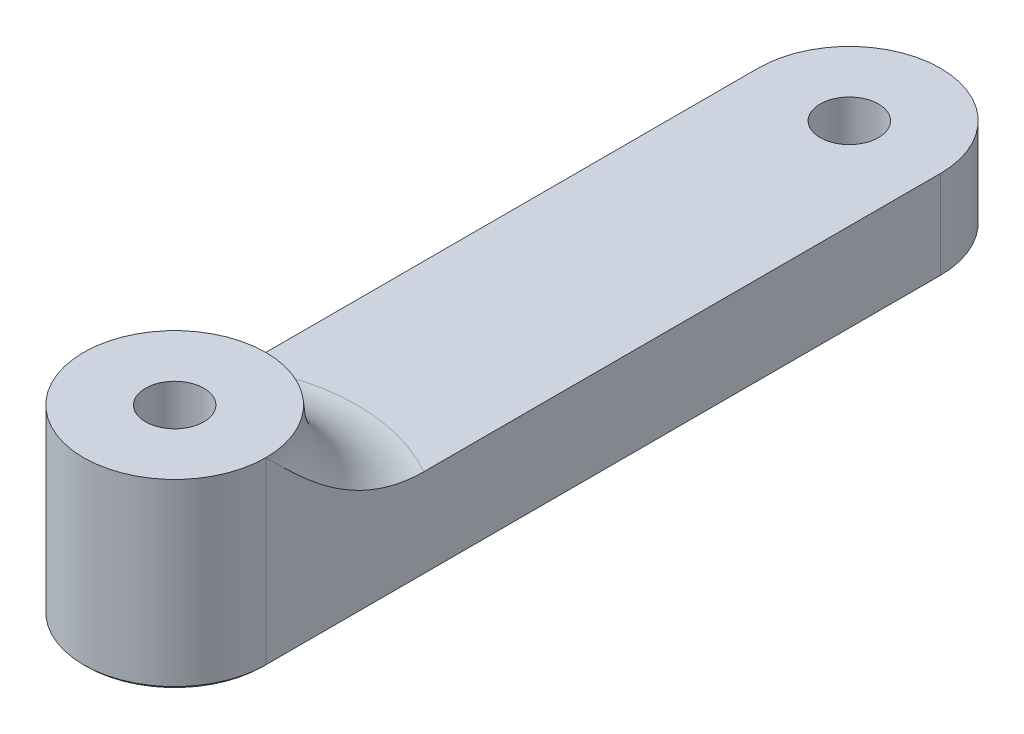
ISO-10303-21;
HEADER;
FILE_DESCRIPTION(('STEP AP214'),'2;1');
FILE_NAME('part.step','',(''),(''),'','','');
FILE_SCHEMA(('AUTOMOTIVE_DESIGN { 1 0 10303 214 1 1 1 1 }'));
ENDSEC;
DATA;
#1=APPLICATION_CONTEXT('core data for automotive mechanical design processes');
#2=APPLICATION_PROTOCOL_DEFINITION('international standard','automotive_design',2000,#1);
#3=PRODUCT_CONTEXT('',#1,'mechanical');
#4=PRODUCT('Part','Part','',(#3));
#5=PRODUCT_RELATED_PRODUCT_CATEGORY('part','',(#4));
#6=PRODUCT_DEFINITION_FORMATION('','',#4);
#7=PRODUCT_DEFINITION_CONTEXT('part definition',#1,'design');
#8=PRODUCT_DEFINITION('design','',#6,#7);
#9=PRODUCT_DEFINITION_SHAPE('','',#8);
#10=(LENGTH_UNIT() NAMED_UNIT(*) SI_UNIT(.MILLI.,.METRE.));
#11=(NAMED_UNIT(*) PLANE_ANGLE_UNIT() SI_UNIT($,.RADIAN.));
#12=(NAMED_UNIT(*) SI_UNIT($,.STERADIAN.) SOLID_ANGLE_UNIT());
#13=UNCERTAINTY_MEASURE_WITH_UNIT(LENGTH_MEASURE(1.E-05),#10,'distance_accuracy_value','');
#14=(GEOMETRIC_REPRESENTATION_CONTEXT(3) GLOBAL_UNCERTAINTY_ASSIGNED_CONTEXT((#13)) GLOBAL_UNIT_ASSIGNED_CONTEXT((#10,
#11,#12)) REPRESENTATION_CONTEXT('',''));
#15=CARTESIAN_POINT('',(0.,0.,0.));
#16=DIRECTION('',(0.,0.,1.));
#17=DIRECTION('',(1.,0.,0.));
#18=AXIS2_PLACEMENT_3D('',#15,#16,#17);
#19=CARTESIAN_POINT('',(5.,5.,0.));
#20=DIRECTION('',(-1.,0.,0.));
#21=DIRECTION('',(0.,0.,1.));
#22=AXIS2_PLACEMENT_3D('',#19,#20,#21);
#23=PLANE('',#22);
#24=DIRECTION('',(0.,-1.,0.));
#25=VECTOR('',#24,1.);
#26=CARTESIAN_POINT('',(5.,5.,0.));
#27=LINE('',#26,#25);
#28=CARTESIAN_POINT('',(5.,10.,0.));
#29=VERTEX_POINT('',#28);
#30=CARTESIAN_POINT('',(5.,0.16,0.));
#31=VERTEX_POINT('',#30);
#32=EDGE_CURVE('E142',#29,#31,#27,.T.);
#33=ORIENTED_EDGE('',*,*,#32,.T.);
#34=DIRECTION('',(0.,0.,-1.));
#35=VECTOR('',#34,1.);
#36=CARTESIAN_POINT('',(5.,0.16,0.));
#37=LINE('',#36,#35);
#38=CARTESIAN_POINT('',(5.,0.16,-37.));
#39=VERTEX_POINT('',#38);
#40=EDGE_CURVE('E140',#31,#39,#37,.T.);
#41=ORIENTED_EDGE('',*,*,#40,.T.);
#42=DIRECTION('',(0.,-1.,0.));
#43=VECTOR('',#42,1.);
#44=CARTESIAN_POINT('',(5.,5.,-37.));
#45=LINE('',#44,#43);
#46=CARTESIAN_POINT('',(5.,5.,-37.));
#47=VERTEX_POINT('',#46);
#48=EDGE_CURVE('E131',#47,#39,#45,.T.);
#49=ORIENTED_EDGE('',*,*,#48,.F.);
#50=DIRECTION('',(0.,0.,-1.));
#51=VECTOR('',#50,1.);
#52=CARTESIAN_POINT('',(5.,5.,0.));
#53=LINE('',#52,#51);
#54=CARTESIAN_POINT('',(5.,5.,-8.66025403784439));
#55=VERTEX_POINT('',#54);
#56=EDGE_CURVE('E116',#55,#47,#53,.T.);
#57=ORIENTED_EDGE('',*,*,#56,.F.);
#58=CARTESIAN_POINT('',(5.,5.,-8.66025403784439));
#59=CARTESIAN_POINT('',(5.,4.99997030347391,-8.44601573076772));
#60=CARTESIAN_POINT('',(5.,5.01032231981149,-8.23190253440315));
#61=CARTESIAN_POINT('',(5.,5.050367720903,-7.80580224774574));
#62=CARTESIAN_POINT('',(5.,5.08003167215685,-7.59381241964386));
#63=CARTESIAN_POINT('',(5.,5.15682193856417,-7.1757075635474));
#64=CARTESIAN_POINT('',(5.,5.20373357631754,-6.96955252783035));
#65=CARTESIAN_POINT('',(5.,5.31359736697606,-6.56149704395633));
#66=CARTESIAN_POINT('',(5.,5.37655718210127,-6.35959867814618));
#67=CARTESIAN_POINT('',(5.,5.54314037058692,-5.88676408232623));
#68=CARTESIAN_POINT('',(5.,5.65317829392465,-5.61808083601015));
#69=CARTESIAN_POINT('',(5.,5.89668641574984,-5.09159904577042));
#70=CARTESIAN_POINT('',(5.,6.03016371630961,-4.83380383034534));
#71=CARTESIAN_POINT('',(5.,6.31742397457007,-4.32824469212616));
#72=CARTESIAN_POINT('',(5.,6.47130085272845,-4.08053454947626));
#73=CARTESIAN_POINT('',(5.,6.7953125127806,-3.59591179315444));
#74=CARTESIAN_POINT('',(5.,6.96545472588687,-3.3590041885937));
#75=CARTESIAN_POINT('',(5.,7.56870777618816,-2.56650316645255));
#76=CARTESIAN_POINT('',(5.,8.03294068419644,-2.0348194830665));
#77=CARTESIAN_POINT('',(5.,8.99476039347401,-1.00542089737336));
#78=CARTESIAN_POINT('',(5.,9.49232114311838,-0.507680062996138));
#79=CARTESIAN_POINT('',(5.,9.99333333304251,-0.00666666894589437));
#80=CARTESIAN_POINT('',(5.,9.99666666638365,-0.00333333561838859));
#81=CARTESIAN_POINT('',(5.,10.,0.));
#82=B_SPLINE_CURVE_WITH_KNOTS('',3,(#58,#59,#60,#61,#62,#63,#64,#65,#66,#67,#68,#69,#70,#71,#72,
#73,#74,#75,#76,#77,#78,#79,#80,#81),.UNSPECIFIED.,.F.,.F.,(4,2,2,2,2,2,2,2,2,2,2,4),(0.,
0.642281703378129,1.28358678373001,1.91716595005278,2.55104818793521,3.42069998684872,
4.29061574416377,5.16468554626525,6.03915661439453,8.15226547096952,10.2637414108498,
10.2778835464735),.UNSPECIFIED.);
#83=EDGE_CURVE('E11',#55,#29,#82,.T.);
#84=ORIENTED_EDGE('',*,*,#83,.T.);
#85=EDGE_LOOP('',(#33,#41,#49,#57,#84));
#86=FACE_BOUND('',#85,.T.);
#87=ADVANCED_FACE('F53',(#86),#23,.F.);
#88=CARTESIAN_POINT('',(0.,5.,-37.));
#89=DIRECTION('',(0.,-1.,0.));
#90=DIRECTION('',(0.,0.,-1.));
#91=AXIS2_PLACEMENT_3D('',#88,#89,#90);
#92=CYLINDRICAL_SURFACE('',#91,5.);
#93=ORIENTED_EDGE('',*,*,#48,.T.);
#94=CARTESIAN_POINT('',(0.,0.16,-37.));
#95=DIRECTION('',(0.,1.,0.));
#96=DIRECTION('',(0.,0.,1.));
#97=AXIS2_PLACEMENT_3D('',#94,#95,#96);
#98=CIRCLE('',#97,5.);
#99=CARTESIAN_POINT('',(-5.,0.16,-37.));
#100=VERTEX_POINT('',#99);
#101=EDGE_CURVE('E178',#39,#100,#98,.T.);
#102=ORIENTED_EDGE('',*,*,#101,.T.);
#103=DIRECTION('',(0.,-1.,0.));
#104=VECTOR('',#103,1.);
#105=CARTESIAN_POINT('',(-5.,5.,-37.));
#106=LINE('',#105,#104);
#107=CARTESIAN_POINT('',(-5.,5.,-37.));
#108=VERTEX_POINT('',#107);
#109=EDGE_CURVE('E134',#108,#100,#106,.T.);
#110=ORIENTED_EDGE('',*,*,#109,.F.);
#111=CARTESIAN_POINT('',(0.,5.,-37.));
#112=DIRECTION('',(0.,1.,0.));
#113=DIRECTION('',(0.,0.,1.));
#114=AXIS2_PLACEMENT_3D('',#111,#112,#113);
#115=CIRCLE('',#114,5.);
#116=EDGE_CURVE('E119',#47,#108,#115,.T.);
#117=ORIENTED_EDGE('',*,*,#116,.F.);
#118=EDGE_LOOP('',(#93,#102,#110,#117));
#119=FACE_BOUND('',#118,.T.);
#120=ADVANCED_FACE('F129',(#119),#92,.T.);
#121=CARTESIAN_POINT('',(0.,5.,-37.));
#122=DIRECTION('',(0.,-1.,0.));
#123=DIRECTION('',(0.,0.,-1.));
#124=AXIS2_PLACEMENT_3D('',#121,#122,#123);
#125=CYLINDRICAL_SURFACE('',#124,1.6);
#126=CARTESIAN_POINT('',(0.,0.160000000000006,-37.));
#127=DIRECTION('',(0.,1.,0.));
#128=DIRECTION('',(0.,0.,1.));
#129=AXIS2_PLACEMENT_3D('',#126,#127,#128);
#130=CIRCLE('',#129,1.6);
#131=CARTESIAN_POINT('',(0.,0.160000000000006,-35.4));
#132=VERTEX_POINT('',#131);
#133=EDGE_CURVE('E189',#132,#132,#130,.F.);
#134=ORIENTED_EDGE('',*,*,#133,.T.);
#135=EDGE_LOOP('',(#134));
#136=FACE_BOUND('',#135,.T.);
#137=CARTESIAN_POINT('',(0.,5.,-37.));
#138=DIRECTION('',(0.,1.,0.));
#139=DIRECTION('',(0.,0.,1.));
#140=AXIS2_PLACEMENT_3D('',#137,#138,#139);
#141=CIRCLE('',#140,1.6);
#142=CARTESIAN_POINT('',(0.,5.,-35.4));
#143=VERTEX_POINT('',#142);
#144=EDGE_CURVE('E125',#143,#143,#141,.T.);
#145=ORIENTED_EDGE('',*,*,#144,.T.);
#146=EDGE_LOOP('',(#145));
#147=FACE_BOUND('',#146,.T.);
#148=ADVANCED_FACE('F219',(#136,#147),#125,.F.);
#149=CARTESIAN_POINT('',(-5.,5.,0.));
#150=DIRECTION('',(-1.,0.,0.));
#151=DIRECTION('',(0.,0.,1.));
#152=AXIS2_PLACEMENT_3D('',#149,#150,#151);
#153=PLANE('',#152);
#154=ORIENTED_EDGE('',*,*,#109,.T.);
#155=DIRECTION('',(0.,0.,1.));
#156=VECTOR('',#155,1.);
#157=CARTESIAN_POINT('',(-5.,0.16,0.));
#158=LINE('',#157,#156);
#159=CARTESIAN_POINT('',(-5.,0.16,0.));
#160=VERTEX_POINT('',#159);
#161=EDGE_CURVE('E181',#100,#160,#158,.T.);
#162=ORIENTED_EDGE('',*,*,#161,.T.);
#163=DIRECTION('',(0.,-1.,0.));
#164=VECTOR('',#163,1.);
#165=CARTESIAN_POINT('',(-5.,5.,0.));
#166=LINE('',#165,#164);
#167=CARTESIAN_POINT('',(-5.,10.,0.));
#168=VERTEX_POINT('',#167);
#169=EDGE_CURVE('E150',#168,#160,#166,.T.);
#170=ORIENTED_EDGE('',*,*,#169,.F.);
#171=CARTESIAN_POINT('',(-5.,5.,-8.66025403784439));
#172=CARTESIAN_POINT('',(-5.,4.99997030347391,-8.44601573076772));
#173=CARTESIAN_POINT('',(-5.,5.01032231981149,-8.23190253440315));
#174=CARTESIAN_POINT('',(-5.,5.050367720903,-7.80580224774574));
#175=CARTESIAN_POINT('',(-5.,5.08003167215685,-7.59381241964386));
#176=CARTESIAN_POINT('',(-5.,5.15682193856417,-7.1757075635474));
#177=CARTESIAN_POINT('',(-5.,5.20373357631754,-6.96955252783035));
#178=CARTESIAN_POINT('',(-5.,5.31359736697606,-6.56149704395633));
#179=CARTESIAN_POINT('',(-5.,5.37655718210127,-6.35959867814618));
#180=CARTESIAN_POINT('',(-5.,5.54314037058692,-5.88676408232623));
#181=CARTESIAN_POINT('',(-5.,5.65317829392465,-5.61808083601015));
#182=CARTESIAN_POINT('',(-5.,5.89668641574984,-5.09159904577042));
#183=CARTESIAN_POINT('',(-5.,6.03016371630961,-4.83380383034534));
#184=CARTESIAN_POINT('',(-5.,6.31742397457007,-4.32824469212616));
#185=CARTESIAN_POINT('',(-5.,6.47130085272845,-4.08053454947626));
#186=CARTESIAN_POINT('',(-5.,6.7953125127806,-3.59591179315444));
#187=CARTESIAN_POINT('',(-5.,6.96545472588687,-3.3590041885937));
#188=CARTESIAN_POINT('',(-5.,7.56870777618816,-2.56650316645255));
#189=CARTESIAN_POINT('',(-5.,8.03294068419644,-2.0348194830665));
#190=CARTESIAN_POINT('',(-5.,8.99476039347401,-1.00542089737336));
#191=CARTESIAN_POINT('',(-5.,9.49232114311838,-0.507680062996138));
#192=CARTESIAN_POINT('',(-5.,9.99333333304251,-0.00666666894589437));
#193=CARTESIAN_POINT('',(-5.,9.99666666638365,-0.00333333561838859));
#194=CARTESIAN_POINT('',(-5.,10.,0.));
#195=B_SPLINE_CURVE_WITH_KNOTS('',3,(#171,#172,#173,#174,#175,#176,#177,#178,#179,#180,#181,
#182,#183,#184,#185,#186,#187,#188,#189,#190,#191,#192,#193,#194),.UNSPECIFIED.,.F.,.F.,(4,2,2,
2,2,2,2,2,2,2,2,4),(0.,0.642281703378129,1.28358678373001,1.91716595005278,2.55104818793521,
3.42069998684872,4.29061574416377,5.16468554626525,6.03915661439453,8.15226547096952,
10.2637414108498,10.2778835464735),.UNSPECIFIED.);
#196=CARTESIAN_POINT('',(-5.,5.,-8.66025403784439));
#197=VERTEX_POINT('',#196);
#198=EDGE_CURVE('E68',#168,#197,#195,.F.);
#199=ORIENTED_EDGE('',*,*,#198,.T.);
#200=DIRECTION('',(0.,0.,-1.));
#201=VECTOR('',#200,1.);
#202=CARTESIAN_POINT('',(-5.,5.,0.));
#203=LINE('',#202,#201);
#204=EDGE_CURVE('E136',#197,#108,#203,.T.);
#205=ORIENTED_EDGE('',*,*,#204,.T.);
#206=EDGE_LOOP('',(#154,#162,#170,#199,#205));
#207=FACE_BOUND('',#206,.T.);
#208=ADVANCED_FACE('F214',(#207),#153,.T.);
#209=CARTESIAN_POINT('',(0.,5.,0.));
#210=DIRECTION('',(0.,1.,0.));
#211=DIRECTION('',(0.,0.,1.));
#212=AXIS2_PLACEMENT_3D('',#209,#210,#211);
#213=PLANE('',#212);
#214=ORIENTED_EDGE('',*,*,#144,.F.);
#215=EDGE_LOOP('',(#214));
#216=FACE_BOUND('',#215,.T.);
#217=ORIENTED_EDGE('',*,*,#204,.F.);
#218=CARTESIAN_POINT('',(0.,5.,0.));
#219=DIRECTION('',(0.,1.,0.));
#220=DIRECTION('',(0.,0.,1.));
#221=AXIS2_PLACEMENT_3D('',#218,#219,#220);
#222=CIRCLE('',#221,10.);
#223=EDGE_CURVE('E81',#197,#55,#222,.F.);
#224=ORIENTED_EDGE('',*,*,#223,.T.);
#225=ORIENTED_EDGE('',*,*,#56,.T.);
#226=ORIENTED_EDGE('',*,*,#116,.T.);
#227=EDGE_LOOP('',(#217,#224,#225,#226));
#228=FACE_BOUND('',#227,.T.);
#229=ADVANCED_FACE('F118',(#216,#228),#213,.T.);
#230=CARTESIAN_POINT('',(0.,0.,0.));
#231=DIRECTION('',(0.,1.,0.));
#232=DIRECTION('',(0.,0.,1.));
#233=AXIS2_PLACEMENT_3D('',#230,#231,#232);
#234=PLANE('',#233);
#235=CARTESIAN_POINT('',(0.,0.,0.));
#236=DIRECTION('',(0.,1.,0.));
#237=DIRECTION('',(0.,0.,1.));
#238=AXIS2_PLACEMENT_3D('',#235,#236,#237);
#239=CIRCLE('',#238,1.76);
#240=CARTESIAN_POINT('',(0.,0.,1.76));
#241=VERTEX_POINT('',#240);
#242=EDGE_CURVE('E170',#241,#241,#239,.T.);
#243=ORIENTED_EDGE('',*,*,#242,.T.);
#244=EDGE_LOOP('',(#243));
#245=FACE_BOUND('',#244,.T.);
#246=DIRECTION('',(0.,0.,-1.));
#247=VECTOR('',#246,1.);
#248=CARTESIAN_POINT('',(-4.84,0.,-37.));
#249=LINE('',#248,#247);
#250=CARTESIAN_POINT('',(-4.84,0.,0.));
#251=VERTEX_POINT('',#250);
#252=CARTESIAN_POINT('',(-4.84,0.,-37.));
#253=VERTEX_POINT('',#252);
#254=EDGE_CURVE('E163',#251,#253,#249,.T.);
#255=ORIENTED_EDGE('',*,*,#254,.T.);
#256=CARTESIAN_POINT('',(0.,0.,-37.));
#257=DIRECTION('',(0.,1.,0.));
#258=DIRECTION('',(0.,0.,1.));
#259=AXIS2_PLACEMENT_3D('',#256,#257,#258);
#260=CIRCLE('',#259,4.84);
#261=CARTESIAN_POINT('',(4.84,0.,-37.));
#262=VERTEX_POINT('',#261);
#263=EDGE_CURVE('E166',#253,#262,#260,.F.);
#264=ORIENTED_EDGE('',*,*,#263,.T.);
#265=DIRECTION('',(0.,0.,1.));
#266=VECTOR('',#265,1.);
#267=CARTESIAN_POINT('',(4.84,0.,0.));
#268=LINE('',#267,#266);
#269=CARTESIAN_POINT('',(4.84,0.,0.));
#270=VERTEX_POINT('',#269);
#271=EDGE_CURVE('E157',#262,#270,#268,.T.);
#272=ORIENTED_EDGE('',*,*,#271,.T.);
#273=CARTESIAN_POINT('',(0.,0.,0.));
#274=DIRECTION('',(0.,1.,0.));
#275=DIRECTION('',(0.,0.,1.));
#276=AXIS2_PLACEMENT_3D('',#273,#274,#275);
#277=CIRCLE('',#276,4.84);
#278=EDGE_CURVE('E160',#270,#251,#277,.F.);
#279=ORIENTED_EDGE('',*,*,#278,.T.);
#280=EDGE_LOOP('',(#255,#264,#272,#279));
#281=FACE_BOUND('',#280,.T.);
#282=CARTESIAN_POINT('',(0.,0.,-37.));
#283=DIRECTION('',(0.,1.,0.));
#284=DIRECTION('',(0.,0.,1.));
#285=AXIS2_PLACEMENT_3D('',#282,#283,#284);
#286=CIRCLE('',#285,1.76);
#287=CARTESIAN_POINT('',(0.,0.,-35.24));
#288=VERTEX_POINT('',#287);
#289=EDGE_CURVE('E147',#288,#288,#286,.T.);
#290=ORIENTED_EDGE('',*,*,#289,.T.);
#291=EDGE_LOOP('',(#290));
#292=FACE_BOUND('',#291,.T.);
#293=ADVANCED_FACE('F220',(#245,#281,#292),#234,.F.);
#294=CARTESIAN_POINT('',(0.,10.,0.));
#295=DIRECTION('',(0.,-1.,0.));
#296=DIRECTION('',(0.,0.,-1.));
#297=AXIS2_PLACEMENT_3D('',#294,#295,#296);
#298=CYLINDRICAL_SURFACE('',#297,5.);
#299=CARTESIAN_POINT('',(0.,10.,0.));
#300=DIRECTION('',(0.,1.,0.));
#301=DIRECTION('',(0.,0.,1.));
#302=AXIS2_PLACEMENT_3D('',#299,#300,#301);
#303=CIRCLE('',#302,5.);
#304=EDGE_CURVE('E206',#168,#29,#303,.T.);
#305=ORIENTED_EDGE('',*,*,#304,.F.);
#306=ORIENTED_EDGE('',*,*,#169,.T.);
#307=CARTESIAN_POINT('',(0.,0.16,0.));
#308=DIRECTION('',(0.,1.,0.));
#309=DIRECTION('',(0.,0.,1.));
#310=AXIS2_PLACEMENT_3D('',#307,#308,#309);
#311=CIRCLE('',#310,5.);
#312=EDGE_CURVE('E184',#160,#31,#311,.T.);
#313=ORIENTED_EDGE('',*,*,#312,.T.);
#314=ORIENTED_EDGE('',*,*,#32,.F.);
#315=EDGE_LOOP('',(#305,#306,#313,#314));
#316=FACE_BOUND('',#315,.T.);
#317=ADVANCED_FACE('F278',(#316),#298,.T.);
#318=CARTESIAN_POINT('',(0.,10.,0.));
#319=DIRECTION('',(0.,-1.,0.));
#320=DIRECTION('',(0.,0.,-1.));
#321=AXIS2_PLACEMENT_3D('',#318,#319,#320);
#322=CYLINDRICAL_SURFACE('',#321,1.6);
#323=CARTESIAN_POINT('',(0.,0.15999999999999,0.));
#324=DIRECTION('',(0.,1.,0.));
#325=DIRECTION('',(0.,0.,1.));
#326=AXIS2_PLACEMENT_3D('',#323,#324,#325);
#327=CIRCLE('',#326,1.6);
#328=CARTESIAN_POINT('',(0.,0.15999999999999,1.6));
#329=VERTEX_POINT('',#328);
#330=EDGE_CURVE('E174',#329,#329,#327,.F.);
#331=ORIENTED_EDGE('',*,*,#330,.T.);
#332=EDGE_LOOP('',(#331));
#333=FACE_BOUND('',#332,.T.);
#334=CARTESIAN_POINT('',(0.,10.,0.));
#335=DIRECTION('',(0.,1.,0.));
#336=DIRECTION('',(0.,0.,1.));
#337=AXIS2_PLACEMENT_3D('',#334,#335,#336);
#338=CIRCLE('',#337,1.6);
#339=CARTESIAN_POINT('',(0.,10.,1.6));
#340=VERTEX_POINT('',#339);
#341=EDGE_CURVE('E305',#340,#340,#338,.T.);
#342=ORIENTED_EDGE('',*,*,#341,.T.);
#343=EDGE_LOOP('',(#342));
#344=FACE_BOUND('',#343,.T.);
#345=ADVANCED_FACE('F283',(#333,#344),#322,.F.);
#346=CARTESIAN_POINT('',(0.,10.,0.));
#347=DIRECTION('',(0.,1.,0.));
#348=DIRECTION('',(0.,0.,1.));
#349=AXIS2_PLACEMENT_3D('',#346,#347,#348);
#350=PLANE('',#349);
#351=EDGE_CURVE('E309',#29,#168,#303,.T.);
#352=ORIENTED_EDGE('',*,*,#351,.T.);
#353=ORIENTED_EDGE('',*,*,#304,.T.);
#354=EDGE_LOOP('',(#352,#353));
#355=FACE_BOUND('',#354,.T.);
#356=ORIENTED_EDGE('',*,*,#341,.F.);
#357=EDGE_LOOP('',(#356));
#358=FACE_BOUND('',#357,.T.);
#359=ADVANCED_FACE('F237',(#355,#358),#350,.T.);
#360=CARTESIAN_POINT('',(0.,0.,0.));
#361=DIRECTION('',(0.,-1.,0.));
#362=DIRECTION('',(0.,0.,-1.));
#363=AXIS2_PLACEMENT_3D('',#360,#361,#362);
#364=CONICAL_SURFACE('',#363,1.76,0.785398163397472);
#365=ORIENTED_EDGE('',*,*,#330,.F.);
#366=EDGE_LOOP('',(#365));
#367=FACE_BOUND('',#366,.T.);
#368=ORIENTED_EDGE('',*,*,#242,.F.);
#369=EDGE_LOOP('',(#368));
#370=FACE_BOUND('',#369,.T.);
#371=ADVANCED_FACE('F230',(#367,#370),#364,.F.);
#372=CARTESIAN_POINT('',(0.,0.16,0.));
#373=DIRECTION('',(0.,1.,0.));
#374=DIRECTION('',(0.,0.,1.));
#375=AXIS2_PLACEMENT_3D('',#372,#373,#374);
#376=CONICAL_SURFACE('',#375,5.,0.785398163397448);
#377=DIRECTION('',(-0.707106781186548,0.707106781186548,0.));
#378=VECTOR('',#377,1.);
#379=CARTESIAN_POINT('',(-4.84,0.,0.));
#380=LINE('',#379,#378);
#381=EDGE_CURVE('E198',#251,#160,#380,.T.);
#382=ORIENTED_EDGE('',*,*,#381,.F.);
#383=ORIENTED_EDGE('',*,*,#278,.F.);
#384=DIRECTION('',(-0.707106781186548,-0.707106781186548,0.));
#385=VECTOR('',#384,1.);
#386=CARTESIAN_POINT('',(5.,0.16,0.));
#387=LINE('',#386,#385);
#388=EDGE_CURVE('E202',#31,#270,#387,.T.);
#389=ORIENTED_EDGE('',*,*,#388,.F.);
#390=ORIENTED_EDGE('',*,*,#312,.F.);
#391=EDGE_LOOP('',(#382,#383,#389,#390));
#392=FACE_BOUND('',#391,.T.);
#393=ADVANCED_FACE('F236',(#392),#376,.T.);
#394=CARTESIAN_POINT('',(5.,0.16,0.));
#395=DIRECTION('',(-0.707106781186548,0.707106781186548,0.));
#396=DIRECTION('',(0.,0.,-1.));
#397=AXIS2_PLACEMENT_3D('',#394,#395,#396);
#398=PLANE('',#397);
#399=ORIENTED_EDGE('',*,*,#388,.T.);
#400=ORIENTED_EDGE('',*,*,#271,.F.);
#401=DIRECTION('',(-0.707106781186548,-0.707106781186548,0.));
#402=VECTOR('',#401,1.);
#403=CARTESIAN_POINT('',(5.,0.16,-37.));
#404=LINE('',#403,#402);
#405=EDGE_CURVE('E196',#39,#262,#404,.T.);
#406=ORIENTED_EDGE('',*,*,#405,.F.);
#407=ORIENTED_EDGE('',*,*,#40,.F.);
#408=EDGE_LOOP('',(#399,#400,#406,#407));
#409=FACE_BOUND('',#408,.T.);
#410=ADVANCED_FACE('F255',(#409),#398,.F.);
#411=CARTESIAN_POINT('',(-4.84,0.,0.));
#412=DIRECTION('',(-0.707106781186548,-0.707106781186548,0.));
#413=DIRECTION('',(0.,0.,1.));
#414=AXIS2_PLACEMENT_3D('',#411,#412,#413);
#415=PLANE('',#414);
#416=ORIENTED_EDGE('',*,*,#381,.T.);
#417=ORIENTED_EDGE('',*,*,#161,.F.);
#418=DIRECTION('',(-0.707106781186548,0.707106781186548,0.));
#419=VECTOR('',#418,1.);
#420=CARTESIAN_POINT('',(-4.84,0.,-37.));
#421=LINE('',#420,#419);
#422=EDGE_CURVE('E193',#253,#100,#421,.T.);
#423=ORIENTED_EDGE('',*,*,#422,.F.);
#424=ORIENTED_EDGE('',*,*,#254,.F.);
#425=EDGE_LOOP('',(#416,#417,#423,#424));
#426=FACE_BOUND('',#425,.T.);
#427=ADVANCED_FACE('F248',(#426),#415,.T.);
#428=CARTESIAN_POINT('',(0.,0.16,-37.));
#429=DIRECTION('',(0.,1.,0.));
#430=DIRECTION('',(0.,0.,1.));
#431=AXIS2_PLACEMENT_3D('',#428,#429,#430);
#432=CONICAL_SURFACE('',#431,5.,0.785398163397448);
#433=ORIENTED_EDGE('',*,*,#405,.T.);
#434=ORIENTED_EDGE('',*,*,#263,.F.);
#435=ORIENTED_EDGE('',*,*,#422,.T.);
#436=ORIENTED_EDGE('',*,*,#101,.F.);
#437=EDGE_LOOP('',(#433,#434,#435,#436));
#438=FACE_BOUND('',#437,.T.);
#439=ADVANCED_FACE('F240',(#438),#432,.T.);
#440=CARTESIAN_POINT('',(0.,0.,-37.));
#441=DIRECTION('',(0.,-1.,0.));
#442=DIRECTION('',(0.,0.,-1.));
#443=AXIS2_PLACEMENT_3D('',#440,#441,#442);
#444=CONICAL_SURFACE('',#443,1.76,0.785398163397432);
#445=ORIENTED_EDGE('',*,*,#133,.F.);
#446=EDGE_LOOP('',(#445));
#447=FACE_BOUND('',#446,.T.);
#448=ORIENTED_EDGE('',*,*,#289,.F.);
#449=EDGE_LOOP('',(#448));
#450=FACE_BOUND('',#449,.T.);
#451=ADVANCED_FACE('F247',(#447,#450),#444,.F.);
#452=CARTESIAN_POINT('',(0.,10.,0.));
#453=DIRECTION('',(0.,1.,0.));
#454=DIRECTION('',(0.,0.,1.));
#455=AXIS2_PLACEMENT_3D('',#452,#453,#454);
#456=TOROIDAL_SURFACE('',#455,10.,5.);
#457=ORIENTED_EDGE('',*,*,#83,.F.);
#458=ORIENTED_EDGE('',*,*,#223,.F.);
#459=ORIENTED_EDGE('',*,*,#198,.F.);
#460=ORIENTED_EDGE('',*,*,#351,.F.);
#461=EDGE_LOOP('',(#457,#458,#459,#460));
#462=FACE_BOUND('',#461,.T.);
#463=ADVANCED_FACE('F55',(#462),#456,.F.);
#464=CLOSED_SHELL('',(#87,#120,#148,#208,#229,#293,#317,#345,#359,#371,#393,#410,#427,#439,#451,#463));
#465=MANIFOLD_SOLID_BREP('B2',#464);
#466=ADVANCED_BREP_SHAPE_REPRESENTATION('',(#18,#465),#14);
#467=SHAPE_DEFINITION_REPRESENTATION(#9,#466);
ENDSEC;
END-ISO-10303-21;
